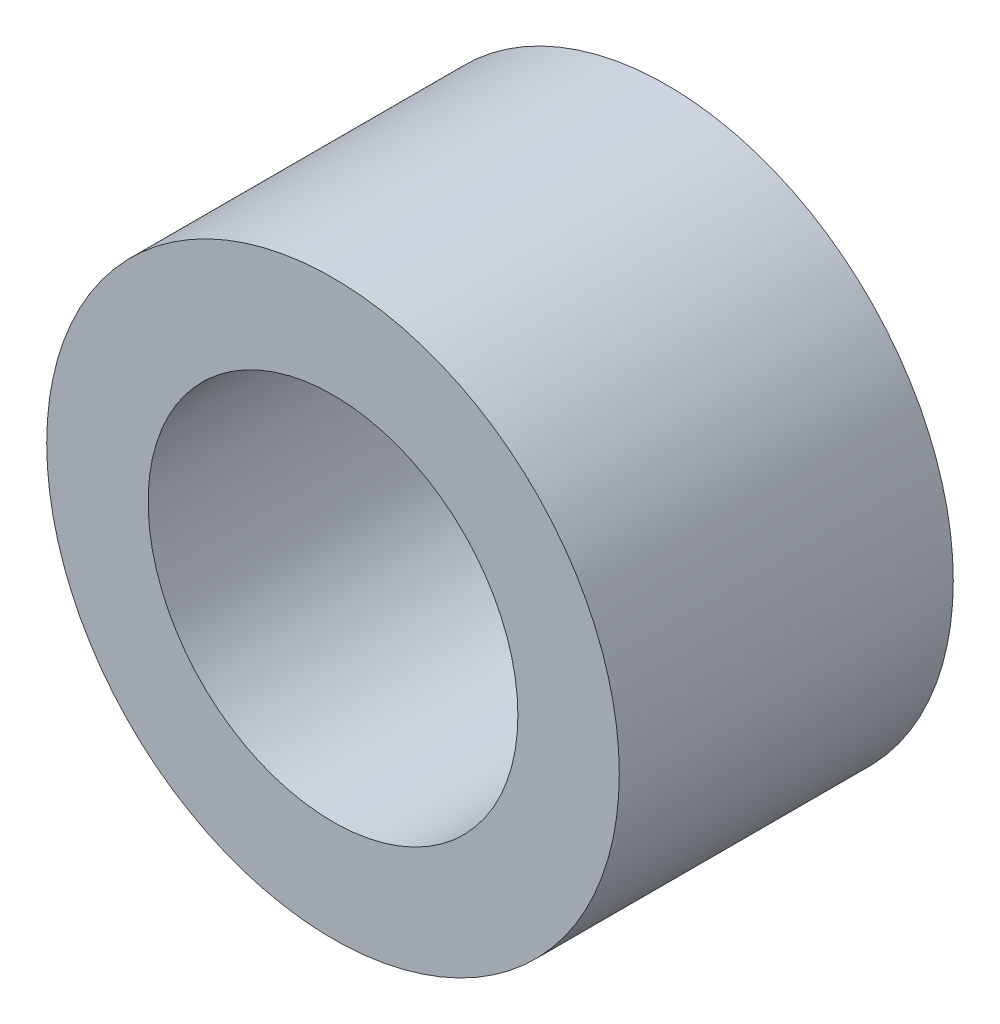
ISO-10303-21;
HEADER;
FILE_DESCRIPTION(('STEP AP214'),'2;1');
FILE_NAME('part.step','',(''),(''),'','','');
FILE_SCHEMA(('AUTOMOTIVE_DESIGN { 1 0 10303 214 1 1 1 1 }'));
ENDSEC;
DATA;
#1=APPLICATION_CONTEXT('core data for automotive mechanical design processes');
#2=APPLICATION_PROTOCOL_DEFINITION('international standard','automotive_design',2000,#1);
#3=PRODUCT_CONTEXT('',#1,'mechanical');
#4=PRODUCT('Part','Part','',(#3));
#5=PRODUCT_RELATED_PRODUCT_CATEGORY('part','',(#4));
#6=PRODUCT_DEFINITION_FORMATION('','',#4);
#7=PRODUCT_DEFINITION_CONTEXT('part definition',#1,'design');
#8=PRODUCT_DEFINITION('design','',#6,#7);
#9=PRODUCT_DEFINITION_SHAPE('','',#8);
#10=(LENGTH_UNIT() NAMED_UNIT(*) SI_UNIT(.MILLI.,.METRE.));
#11=(NAMED_UNIT(*) PLANE_ANGLE_UNIT() SI_UNIT($,.RADIAN.));
#12=(NAMED_UNIT(*) SI_UNIT($,.STERADIAN.) SOLID_ANGLE_UNIT());
#13=UNCERTAINTY_MEASURE_WITH_UNIT(LENGTH_MEASURE(1.E-05),#10,'distance_accuracy_value','');
#14=(GEOMETRIC_REPRESENTATION_CONTEXT(3) GLOBAL_UNCERTAINTY_ASSIGNED_CONTEXT((#13)) GLOBAL_UNIT_ASSIGNED_CONTEXT((#10,
#11,#12)) REPRESENTATION_CONTEXT('',''));
#15=CARTESIAN_POINT('',(0.,0.,0.));
#16=DIRECTION('',(0.,0.,1.));
#17=DIRECTION('',(1.,0.,0.));
#18=AXIS2_PLACEMENT_3D('',#15,#16,#17);
#19=CARTESIAN_POINT('',(0.,0.,28.));
#20=DIRECTION('',(0.,0.,1.));
#21=DIRECTION('',(1.,0.,0.));
#22=AXIS2_PLACEMENT_3D('',#19,#20,#21);
#23=PLANE('',#22);
#24=CARTESIAN_POINT('',(0.,0.,28.));
#25=DIRECTION('',(0.,0.,1.));
#26=DIRECTION('',(1.,0.,0.));
#27=AXIS2_PLACEMENT_3D('',#24,#25,#26);
#28=CIRCLE('',#27,24.);
#29=CARTESIAN_POINT('',(24.,0.,28.));
#30=VERTEX_POINT('',#29);
#31=EDGE_CURVE('E10',#30,#30,#28,.T.);
#32=ORIENTED_EDGE('',*,*,#31,.T.);
#33=EDGE_LOOP('',(#32));
#34=FACE_BOUND('',#33,.T.);
#35=CARTESIAN_POINT('',(0.,0.,28.));
#36=DIRECTION('',(0.,0.,1.));
#37=DIRECTION('',(1.,0.,0.));
#38=AXIS2_PLACEMENT_3D('',#35,#36,#37);
#39=CIRCLE('',#38,15.5);
#40=CARTESIAN_POINT('',(15.5,0.,28.));
#41=VERTEX_POINT('',#40);
#42=EDGE_CURVE('E48',#41,#41,#39,.T.);
#43=ORIENTED_EDGE('',*,*,#42,.F.);
#44=EDGE_LOOP('',(#43));
#45=FACE_BOUND('',#44,.T.);
#46=ADVANCED_FACE('F37',(#34,#45),#23,.T.);
#47=CARTESIAN_POINT('',(0.,0.,0.));
#48=DIRECTION('',(0.,0.,1.));
#49=DIRECTION('',(1.,0.,0.));
#50=AXIS2_PLACEMENT_3D('',#47,#48,#49);
#51=PLANE('',#50);
#52=CARTESIAN_POINT('',(0.,0.,0.));
#53=DIRECTION('',(0.,0.,1.));
#54=DIRECTION('',(1.,0.,0.));
#55=AXIS2_PLACEMENT_3D('',#52,#53,#54);
#56=CIRCLE('',#55,24.);
#57=CARTESIAN_POINT('',(24.,0.,0.));
#58=VERTEX_POINT('',#57);
#59=EDGE_CURVE('E41',#58,#58,#56,.T.);
#60=ORIENTED_EDGE('',*,*,#59,.F.);
#61=EDGE_LOOP('',(#60));
#62=FACE_BOUND('',#61,.T.);
#63=CARTESIAN_POINT('',(0.,0.,0.));
#64=DIRECTION('',(0.,0.,1.));
#65=DIRECTION('',(1.,0.,0.));
#66=AXIS2_PLACEMENT_3D('',#63,#64,#65);
#67=CIRCLE('',#66,15.5);
#68=CARTESIAN_POINT('',(15.5,0.,0.));
#69=VERTEX_POINT('',#68);
#70=EDGE_CURVE('E50',#69,#69,#67,.T.);
#71=ORIENTED_EDGE('',*,*,#70,.T.);
#72=EDGE_LOOP('',(#71));
#73=FACE_BOUND('',#72,.T.);
#74=ADVANCED_FACE('F60',(#62,#73),#51,.F.);
#75=CARTESIAN_POINT('',(0.,0.,28.));
#76=DIRECTION('',(0.,0.,-1.));
#77=DIRECTION('',(-1.,0.,0.));
#78=AXIS2_PLACEMENT_3D('',#75,#76,#77);
#79=CYLINDRICAL_SURFACE('',#78,24.);
#80=ORIENTED_EDGE('',*,*,#31,.F.);
#81=EDGE_LOOP('',(#80));
#82=FACE_BOUND('',#81,.T.);
#83=ORIENTED_EDGE('',*,*,#59,.T.);
#84=EDGE_LOOP('',(#83));
#85=FACE_BOUND('',#84,.T.);
#86=ADVANCED_FACE('F39',(#82,#85),#79,.T.);
#87=CARTESIAN_POINT('',(0.,0.,28.));
#88=DIRECTION('',(0.,0.,-1.));
#89=DIRECTION('',(-1.,0.,0.));
#90=AXIS2_PLACEMENT_3D('',#87,#88,#89);
#91=CYLINDRICAL_SURFACE('',#90,15.5);
#92=ORIENTED_EDGE('',*,*,#42,.T.);
#93=EDGE_LOOP('',(#92));
#94=FACE_BOUND('',#93,.T.);
#95=ORIENTED_EDGE('',*,*,#70,.F.);
#96=EDGE_LOOP('',(#95));
#97=FACE_BOUND('',#96,.T.);
#98=ADVANCED_FACE('F56',(#94,#97),#91,.F.);
#99=CLOSED_SHELL('',(#46,#74,#86,#98));
#100=MANIFOLD_SOLID_BREP('B2',#99);
#101=ADVANCED_BREP_SHAPE_REPRESENTATION('',(#18,#100),#14);
#102=SHAPE_DEFINITION_REPRESENTATION(#9,#101);
ENDSEC;
END-ISO-10303-21;
